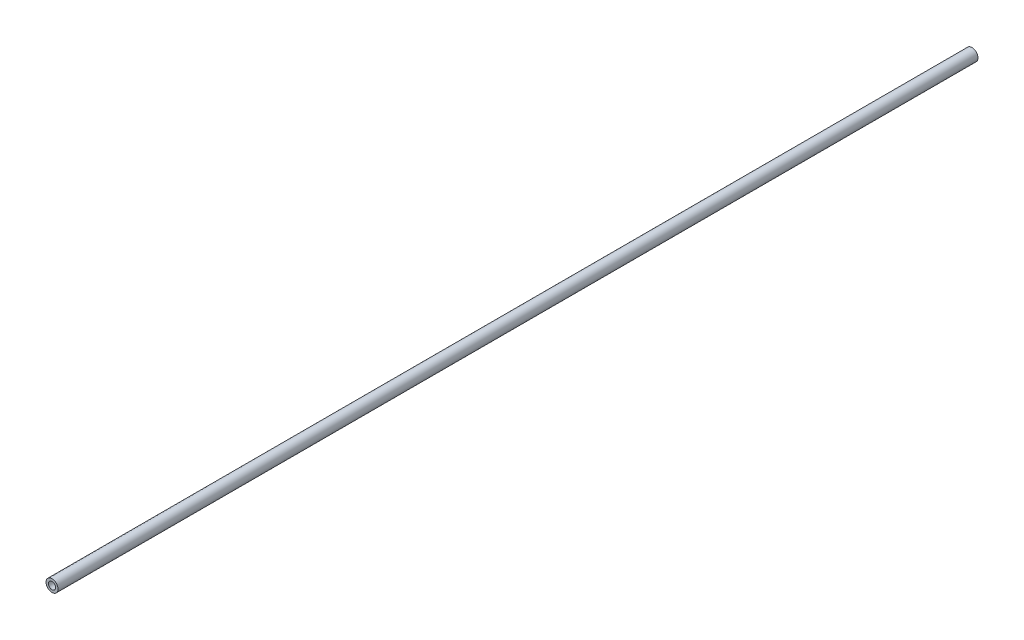
ISO-10303-21;
HEADER;
FILE_DESCRIPTION(('STEP AP214'),'2;1');
FILE_NAME('part.step','',(''),(''),'','','');
FILE_SCHEMA(('AUTOMOTIVE_DESIGN { 1 0 10303 214 1 1 1 1 }'));
ENDSEC;
DATA;
#1=APPLICATION_CONTEXT('core data for automotive mechanical design processes');
#2=APPLICATION_PROTOCOL_DEFINITION('international standard','automotive_design',2000,#1);
#3=PRODUCT_CONTEXT('',#1,'mechanical');
#4=PRODUCT('Part','Part','',(#3));
#5=PRODUCT_RELATED_PRODUCT_CATEGORY('part','',(#4));
#6=PRODUCT_DEFINITION_FORMATION('','',#4);
#7=PRODUCT_DEFINITION_CONTEXT('part definition',#1,'design');
#8=PRODUCT_DEFINITION('design','',#6,#7);
#9=PRODUCT_DEFINITION_SHAPE('','',#8);
#10=(LENGTH_UNIT() NAMED_UNIT(*) SI_UNIT(.MILLI.,.METRE.));
#11=(NAMED_UNIT(*) PLANE_ANGLE_UNIT() SI_UNIT($,.RADIAN.));
#12=(NAMED_UNIT(*) SI_UNIT($,.STERADIAN.) SOLID_ANGLE_UNIT());
#13=UNCERTAINTY_MEASURE_WITH_UNIT(LENGTH_MEASURE(1.E-05),#10,'distance_accuracy_value','');
#14=(GEOMETRIC_REPRESENTATION_CONTEXT(3) GLOBAL_UNCERTAINTY_ASSIGNED_CONTEXT((#13)) GLOBAL_UNIT_ASSIGNED_CONTEXT((#10,
#11,#12)) REPRESENTATION_CONTEXT('',''));
#15=CARTESIAN_POINT('',(0.,0.,0.));
#16=DIRECTION('',(0.,0.,1.));
#17=DIRECTION('',(1.,0.,0.));
#18=AXIS2_PLACEMENT_3D('',#15,#16,#17);
#19=CARTESIAN_POINT('',(0.,1.984375,152.4));
#20=DIRECTION('',(0.,0.,-1.));
#21=DIRECTION('',(0.,1.,0.));
#22=AXIS2_PLACEMENT_3D('',#19,#20,#21);
#23=PLANE('',#22);
#24=CARTESIAN_POINT('',(0.,0.,152.4));
#25=DIRECTION('',(0.,0.,1.));
#26=DIRECTION('',(0.,-1.,0.));
#27=AXIS2_PLACEMENT_3D('',#24,#25,#26);
#28=CIRCLE('',#27,1.190625);
#29=CARTESIAN_POINT('',(0.,-1.190625,152.4));
#30=VERTEX_POINT('',#29);
#31=EDGE_CURVE('E10',#30,#30,#28,.T.);
#32=ORIENTED_EDGE('',*,*,#31,.F.);
#33=EDGE_LOOP('',(#32));
#34=FACE_BOUND('',#33,.T.);
#35=CARTESIAN_POINT('',(0.,0.,152.4));
#36=DIRECTION('',(0.,0.,1.));
#37=DIRECTION('',(0.,-1.,0.));
#38=AXIS2_PLACEMENT_3D('',#35,#36,#37);
#39=CIRCLE('',#38,1.984375);
#40=CARTESIAN_POINT('',(0.,-1.984375,152.4));
#41=VERTEX_POINT('',#40);
#42=EDGE_CURVE('E54',#41,#41,#39,.T.);
#43=ORIENTED_EDGE('',*,*,#42,.T.);
#44=EDGE_LOOP('',(#43));
#45=FACE_BOUND('',#44,.T.);
#46=ADVANCED_FACE('F37',(#34,#45),#23,.F.);
#47=CARTESIAN_POINT('',(0.,0.,152.4));
#48=DIRECTION('',(0.,0.,1.));
#49=DIRECTION('',(0.,-1.,0.));
#50=AXIS2_PLACEMENT_3D('',#47,#48,#49);
#51=CYLINDRICAL_SURFACE('',#50,1.190625);
#52=CARTESIAN_POINT('',(0.,0.,-152.4));
#53=DIRECTION('',(0.,0.,1.));
#54=DIRECTION('',(0.,-1.,0.));
#55=AXIS2_PLACEMENT_3D('',#52,#53,#54);
#56=CIRCLE('',#55,1.190625);
#57=CARTESIAN_POINT('',(0.,-1.19062499999994,-152.4));
#58=VERTEX_POINT('',#57);
#59=EDGE_CURVE('E44',#58,#58,#56,.T.);
#60=ORIENTED_EDGE('',*,*,#59,.F.);
#61=EDGE_LOOP('',(#60));
#62=FACE_BOUND('',#61,.T.);
#63=ORIENTED_EDGE('',*,*,#31,.T.);
#64=EDGE_LOOP('',(#63));
#65=FACE_BOUND('',#64,.T.);
#66=ADVANCED_FACE('F70',(#62,#65),#51,.F.);
#67=CARTESIAN_POINT('',(0.,1.98437500000006,-152.4));
#68=DIRECTION('',(0.,0.,1.));
#69=DIRECTION('',(0.,-1.,0.));
#70=AXIS2_PLACEMENT_3D('',#67,#68,#69);
#71=PLANE('',#70);
#72=CARTESIAN_POINT('',(0.,0.,-152.4));
#73=DIRECTION('',(0.,0.,1.));
#74=DIRECTION('',(0.,-1.,0.));
#75=AXIS2_PLACEMENT_3D('',#72,#73,#74);
#76=CIRCLE('',#75,1.984375);
#77=CARTESIAN_POINT('',(0.,-1.98437499999994,-152.4));
#78=VERTEX_POINT('',#77);
#79=EDGE_CURVE('E49',#78,#78,#76,.T.);
#80=ORIENTED_EDGE('',*,*,#79,.F.);
#81=EDGE_LOOP('',(#80));
#82=FACE_BOUND('',#81,.T.);
#83=ORIENTED_EDGE('',*,*,#59,.T.);
#84=EDGE_LOOP('',(#83));
#85=FACE_BOUND('',#84,.T.);
#86=ADVANCED_FACE('F65',(#82,#85),#71,.F.);
#87=CARTESIAN_POINT('',(0.,0.,152.4));
#88=DIRECTION('',(0.,0.,1.));
#89=DIRECTION('',(0.,-1.,0.));
#90=AXIS2_PLACEMENT_3D('',#87,#88,#89);
#91=CYLINDRICAL_SURFACE('',#90,1.984375);
#92=ORIENTED_EDGE('',*,*,#42,.F.);
#93=EDGE_LOOP('',(#92));
#94=FACE_BOUND('',#93,.T.);
#95=ORIENTED_EDGE('',*,*,#79,.T.);
#96=EDGE_LOOP('',(#95));
#97=FACE_BOUND('',#96,.T.);
#98=ADVANCED_FACE('F62',(#94,#97),#91,.T.);
#99=CLOSED_SHELL('',(#46,#66,#86,#98));
#100=MANIFOLD_SOLID_BREP('B2',#99);
#101=ADVANCED_BREP_SHAPE_REPRESENTATION('',(#18,#100),#14);
#102=SHAPE_DEFINITION_REPRESENTATION(#9,#101);
ENDSEC;
END-ISO-10303-21;
